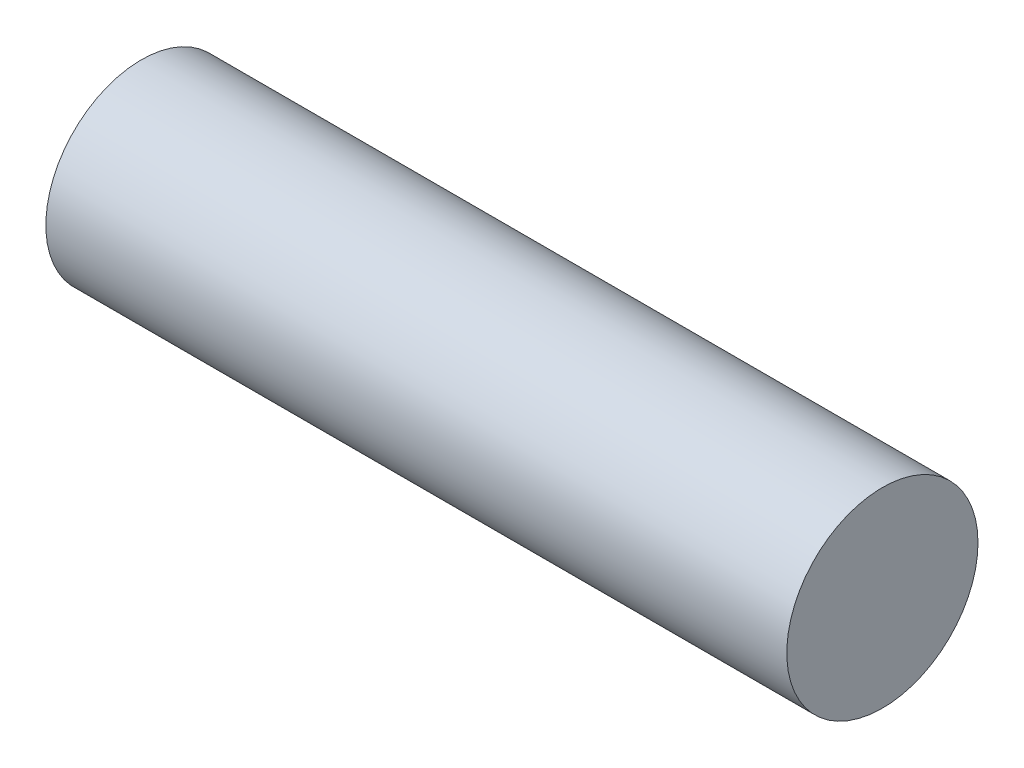
ISO-10303-21;
HEADER;
FILE_DESCRIPTION(('STEP AP214'),'2;1');
FILE_NAME('part.step','',(''),(''),'','','');
FILE_SCHEMA(('AUTOMOTIVE_DESIGN { 1 0 10303 214 1 1 1 1 }'));
ENDSEC;
DATA;
#1=APPLICATION_CONTEXT('core data for automotive mechanical design processes');
#2=APPLICATION_PROTOCOL_DEFINITION('international standard','automotive_design',2000,#1);
#3=PRODUCT_CONTEXT('',#1,'mechanical');
#4=PRODUCT('Part','Part','',(#3));
#5=PRODUCT_RELATED_PRODUCT_CATEGORY('part','',(#4));
#6=PRODUCT_DEFINITION_FORMATION('','',#4);
#7=PRODUCT_DEFINITION_CONTEXT('part definition',#1,'design');
#8=PRODUCT_DEFINITION('design','',#6,#7);
#9=PRODUCT_DEFINITION_SHAPE('','',#8);
#10=(LENGTH_UNIT() NAMED_UNIT(*) SI_UNIT(.MILLI.,.METRE.));
#11=(NAMED_UNIT(*) PLANE_ANGLE_UNIT() SI_UNIT($,.RADIAN.));
#12=(NAMED_UNIT(*) SI_UNIT($,.STERADIAN.) SOLID_ANGLE_UNIT());
#13=UNCERTAINTY_MEASURE_WITH_UNIT(LENGTH_MEASURE(1.E-05),#10,'distance_accuracy_value','');
#14=(GEOMETRIC_REPRESENTATION_CONTEXT(3) GLOBAL_UNCERTAINTY_ASSIGNED_CONTEXT((#13)) GLOBAL_UNIT_ASSIGNED_CONTEXT((#10,
#11,#12)) REPRESENTATION_CONTEXT('',''));
#15=CARTESIAN_POINT('',(0.,0.,0.));
#16=DIRECTION('',(0.,0.,1.));
#17=DIRECTION('',(1.,0.,0.));
#18=AXIS2_PLACEMENT_3D('',#15,#16,#17);
#19=CARTESIAN_POINT('',(0.,0.,0.));
#20=DIRECTION('',(1.,0.,0.));
#21=DIRECTION('',(0.,0.,-1.));
#22=AXIS2_PLACEMENT_3D('',#19,#20,#21);
#23=PLANE('',#22);
#24=CARTESIAN_POINT('',(0.,0.,0.));
#25=DIRECTION('',(1.,0.,0.));
#26=DIRECTION('',(0.,0.,-1.));
#27=AXIS2_PLACEMENT_3D('',#24,#25,#26);
#28=CIRCLE('',#27,4.);
#29=CARTESIAN_POINT('',(0.,0.,-4.));
#30=VERTEX_POINT('',#29);
#31=EDGE_CURVE('E10',#30,#30,#28,.T.);
#32=ORIENTED_EDGE('',*,*,#31,.F.);
#33=EDGE_LOOP('',(#32));
#34=FACE_BOUND('',#33,.T.);
#35=CARTESIAN_POINT('',(0.,0.,0.));
#36=DIRECTION('',(1.,0.,0.));
#37=DIRECTION('',(0.,0.,-1.));
#38=AXIS2_PLACEMENT_3D('',#35,#36,#37);
#39=CIRCLE('',#38,3.);
#40=CARTESIAN_POINT('',(0.,0.,-3.));
#41=VERTEX_POINT('',#40);
#42=EDGE_CURVE('E51',#41,#41,#39,.T.);
#43=ORIENTED_EDGE('',*,*,#42,.T.);
#44=EDGE_LOOP('',(#43));
#45=FACE_BOUND('',#44,.T.);
#46=ADVANCED_FACE('F43',(#34,#45),#23,.F.);
#47=CARTESIAN_POINT('',(30.,0.,0.));
#48=DIRECTION('',(-1.,0.,0.));
#49=DIRECTION('',(0.,0.,1.));
#50=AXIS2_PLACEMENT_3D('',#47,#48,#49);
#51=CYLINDRICAL_SURFACE('',#50,4.);
#52=ORIENTED_EDGE('',*,*,#31,.T.);
#53=EDGE_LOOP('',(#52));
#54=FACE_BOUND('',#53,.T.);
#55=CARTESIAN_POINT('',(31.,0.,0.));
#56=DIRECTION('',(1.,0.,0.));
#57=DIRECTION('',(0.,0.,-1.));
#58=AXIS2_PLACEMENT_3D('',#55,#56,#57);
#59=CIRCLE('',#58,4.);
#60=CARTESIAN_POINT('',(31.,0.,-4.));
#61=VERTEX_POINT('',#60);
#62=EDGE_CURVE('E61',#61,#61,#59,.T.);
#63=ORIENTED_EDGE('',*,*,#62,.F.);
#64=EDGE_LOOP('',(#63));
#65=FACE_BOUND('',#64,.T.);
#66=ADVANCED_FACE('F45',(#54,#65),#51,.T.);
#67=CARTESIAN_POINT('',(30.,0.,0.));
#68=DIRECTION('',(-1.,0.,0.));
#69=DIRECTION('',(0.,0.,1.));
#70=AXIS2_PLACEMENT_3D('',#67,#68,#69);
#71=CYLINDRICAL_SURFACE('',#70,3.);
#72=CARTESIAN_POINT('',(30.,0.,0.));
#73=DIRECTION('',(1.,0.,0.));
#74=DIRECTION('',(0.,0.,-1.));
#75=AXIS2_PLACEMENT_3D('',#72,#73,#74);
#76=CIRCLE('',#75,3.);
#77=CARTESIAN_POINT('',(30.,0.,-3.));
#78=VERTEX_POINT('',#77);
#79=EDGE_CURVE('E56',#78,#78,#76,.T.);
#80=ORIENTED_EDGE('',*,*,#79,.T.);
#81=EDGE_LOOP('',(#80));
#82=FACE_BOUND('',#81,.T.);
#83=ORIENTED_EDGE('',*,*,#42,.F.);
#84=EDGE_LOOP('',(#83));
#85=FACE_BOUND('',#84,.T.);
#86=ADVANCED_FACE('F71',(#82,#85),#71,.F.);
#87=CARTESIAN_POINT('',(30.,0.,0.));
#88=DIRECTION('',(1.,0.,0.));
#89=DIRECTION('',(0.,0.,-1.));
#90=AXIS2_PLACEMENT_3D('',#87,#88,#89);
#91=PLANE('',#90);
#92=ORIENTED_EDGE('',*,*,#79,.F.);
#93=EDGE_LOOP('',(#92));
#94=FACE_BOUND('',#93,.T.);
#95=ADVANCED_FACE('F76',(#94),#91,.F.);
#96=CARTESIAN_POINT('',(31.,0.,0.));
#97=DIRECTION('',(1.,0.,0.));
#98=DIRECTION('',(0.,0.,-1.));
#99=AXIS2_PLACEMENT_3D('',#96,#97,#98);
#100=PLANE('',#99);
#101=ORIENTED_EDGE('',*,*,#62,.T.);
#102=EDGE_LOOP('',(#101));
#103=FACE_BOUND('',#102,.T.);
#104=ADVANCED_FACE('F68',(#103),#100,.T.);
#105=CLOSED_SHELL('',(#46,#66,#86,#95,#104));
#106=MANIFOLD_SOLID_BREP('B2',#105);
#107=ADVANCED_BREP_SHAPE_REPRESENTATION('',(#18,#106),#14);
#108=SHAPE_DEFINITION_REPRESENTATION(#9,#107);
ENDSEC;
END-ISO-10303-21;
